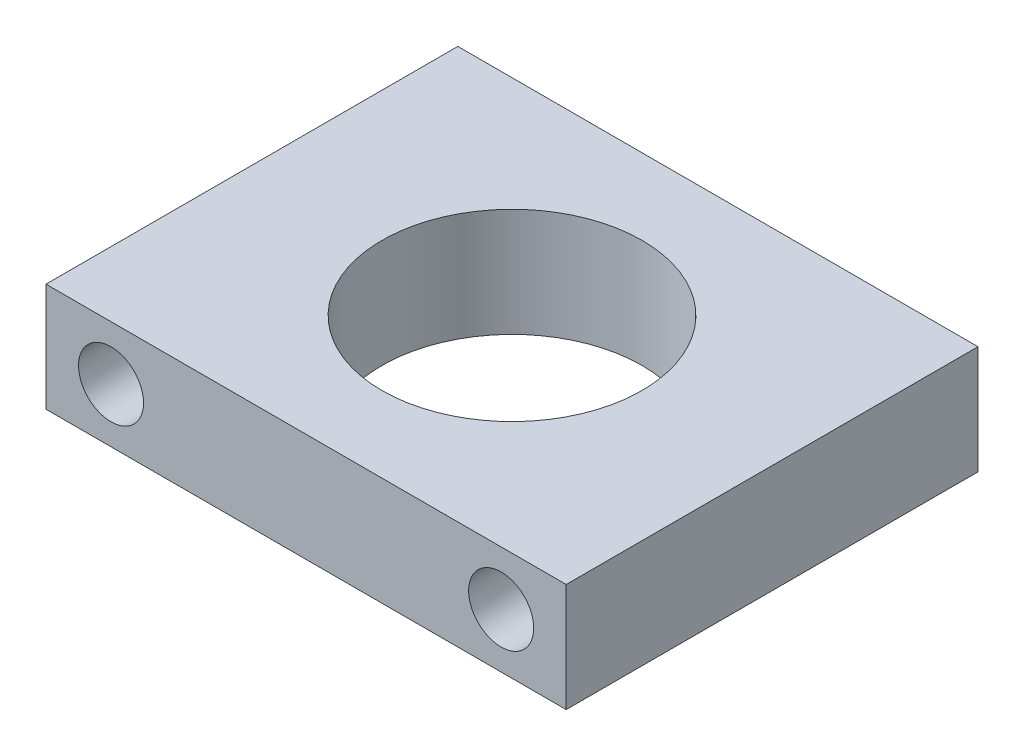
ISO-10303-21;
HEADER;
FILE_DESCRIPTION(('STEP AP214'),'2;1');
FILE_NAME('part.step','',(''),(''),'','','');
FILE_SCHEMA(('AUTOMOTIVE_DESIGN { 1 0 10303 214 1 1 1 1 }'));
ENDSEC;
DATA;
#1=APPLICATION_CONTEXT('core data for automotive mechanical design processes');
#2=APPLICATION_PROTOCOL_DEFINITION('international standard','automotive_design',2000,#1);
#3=PRODUCT_CONTEXT('',#1,'mechanical');
#4=PRODUCT('Part','Part','',(#3));
#5=PRODUCT_RELATED_PRODUCT_CATEGORY('part','',(#4));
#6=PRODUCT_DEFINITION_FORMATION('','',#4);
#7=PRODUCT_DEFINITION_CONTEXT('part definition',#1,'design');
#8=PRODUCT_DEFINITION('design','',#6,#7);
#9=PRODUCT_DEFINITION_SHAPE('','',#8);
#10=(LENGTH_UNIT() NAMED_UNIT(*) SI_UNIT(.MILLI.,.METRE.));
#11=(NAMED_UNIT(*) PLANE_ANGLE_UNIT() SI_UNIT($,.RADIAN.));
#12=(NAMED_UNIT(*) SI_UNIT($,.STERADIAN.) SOLID_ANGLE_UNIT());
#13=UNCERTAINTY_MEASURE_WITH_UNIT(LENGTH_MEASURE(1.E-05),#10,'distance_accuracy_value','');
#14=(GEOMETRIC_REPRESENTATION_CONTEXT(3) GLOBAL_UNCERTAINTY_ASSIGNED_CONTEXT((#13)) GLOBAL_UNIT_ASSIGNED_CONTEXT((#10,
#11,#12)) REPRESENTATION_CONTEXT('',''));
#15=CARTESIAN_POINT('',(0.,0.,0.));
#16=DIRECTION('',(0.,0.,1.));
#17=DIRECTION('',(1.,0.,0.));
#18=AXIS2_PLACEMENT_3D('',#15,#16,#17);
#19=CARTESIAN_POINT('',(12.,5.,-9.5));
#20=DIRECTION('',(-1.,0.,0.));
#21=DIRECTION('',(0.,0.,1.));
#22=AXIS2_PLACEMENT_3D('',#19,#20,#21);
#23=PLANE('',#22);
#24=DIRECTION('',(0.,0.,-1.));
#25=VECTOR('',#24,1.);
#26=CARTESIAN_POINT('',(12.,0.,-9.5));
#27=LINE('',#26,#25);
#28=CARTESIAN_POINT('',(12.,0.,9.5));
#29=VERTEX_POINT('',#28);
#30=CARTESIAN_POINT('',(12.,0.,-9.5));
#31=VERTEX_POINT('',#30);
#32=EDGE_CURVE('E98',#29,#31,#27,.T.);
#33=ORIENTED_EDGE('',*,*,#32,.T.);
#34=DIRECTION('',(0.,-1.,0.));
#35=VECTOR('',#34,1.);
#36=CARTESIAN_POINT('',(12.,5.,-9.5));
#37=LINE('',#36,#35);
#38=CARTESIAN_POINT('',(12.,5.,-9.5));
#39=VERTEX_POINT('',#38);
#40=EDGE_CURVE('E11',#39,#31,#37,.T.);
#41=ORIENTED_EDGE('',*,*,#40,.F.);
#42=DIRECTION('',(0.,0.,-1.));
#43=VECTOR('',#42,1.);
#44=CARTESIAN_POINT('',(12.,5.,-9.5));
#45=LINE('',#44,#43);
#46=CARTESIAN_POINT('',(12.,5.,9.5));
#47=VERTEX_POINT('',#46);
#48=EDGE_CURVE('E86',#47,#39,#45,.T.);
#49=ORIENTED_EDGE('',*,*,#48,.F.);
#50=DIRECTION('',(0.,-1.,0.));
#51=VECTOR('',#50,1.);
#52=CARTESIAN_POINT('',(12.,5.,9.5));
#53=LINE('',#52,#51);
#54=EDGE_CURVE('E94',#47,#29,#53,.T.);
#55=ORIENTED_EDGE('',*,*,#54,.T.);
#56=EDGE_LOOP('',(#33,#41,#49,#55));
#57=FACE_BOUND('',#56,.T.);
#58=ADVANCED_FACE('F35',(#57),#23,.F.);
#59=CARTESIAN_POINT('',(-12.,5.,-9.5));
#60=DIRECTION('',(0.,0.,1.));
#61=DIRECTION('',(1.,0.,0.));
#62=AXIS2_PLACEMENT_3D('',#59,#60,#61);
#63=PLANE('',#62);
#64=CARTESIAN_POINT('',(-9.,2.5,-9.5));
#65=DIRECTION('',(0.,0.,1.));
#66=DIRECTION('',(1.,0.,0.));
#67=AXIS2_PLACEMENT_3D('',#64,#65,#66);
#68=CIRCLE('',#67,1.5);
#69=CARTESIAN_POINT('',(-7.5,2.5,-9.5));
#70=VERTEX_POINT('',#69);
#71=EDGE_CURVE('E117',#70,#70,#68,.F.);
#72=ORIENTED_EDGE('',*,*,#71,.F.);
#73=EDGE_LOOP('',(#72));
#74=FACE_BOUND('',#73,.T.);
#75=CARTESIAN_POINT('',(9.,2.5,-9.5));
#76=DIRECTION('',(0.,0.,1.));
#77=DIRECTION('',(1.,0.,0.));
#78=AXIS2_PLACEMENT_3D('',#75,#76,#77);
#79=CIRCLE('',#78,1.5);
#80=CARTESIAN_POINT('',(10.5,2.5,-9.5));
#81=VERTEX_POINT('',#80);
#82=EDGE_CURVE('E118',#81,#81,#79,.F.);
#83=ORIENTED_EDGE('',*,*,#82,.F.);
#84=EDGE_LOOP('',(#83));
#85=FACE_BOUND('',#84,.T.);
#86=DIRECTION('',(-1.,0.,0.));
#87=VECTOR('',#86,1.);
#88=CARTESIAN_POINT('',(-12.,0.,-9.5));
#89=LINE('',#88,#87);
#90=CARTESIAN_POINT('',(-12.,0.,-9.5));
#91=VERTEX_POINT('',#90);
#92=EDGE_CURVE('E90',#31,#91,#89,.T.);
#93=ORIENTED_EDGE('',*,*,#92,.T.);
#94=DIRECTION('',(0.,-1.,0.));
#95=VECTOR('',#94,1.);
#96=CARTESIAN_POINT('',(-12.,5.,-9.5));
#97=LINE('',#96,#95);
#98=CARTESIAN_POINT('',(-12.,5.,-9.5));
#99=VERTEX_POINT('',#98);
#100=EDGE_CURVE('E43',#99,#91,#97,.T.);
#101=ORIENTED_EDGE('',*,*,#100,.F.);
#102=DIRECTION('',(-1.,0.,0.));
#103=VECTOR('',#102,1.);
#104=CARTESIAN_POINT('',(-12.,5.,-9.5));
#105=LINE('',#104,#103);
#106=EDGE_CURVE('E81',#39,#99,#105,.T.);
#107=ORIENTED_EDGE('',*,*,#106,.F.);
#108=ORIENTED_EDGE('',*,*,#40,.T.);
#109=EDGE_LOOP('',(#93,#101,#107,#108));
#110=FACE_BOUND('',#109,.T.);
#111=ADVANCED_FACE('F89',(#74,#85,#110),#63,.F.);
#112=CARTESIAN_POINT('',(-12.,5.,-9.5));
#113=DIRECTION('',(1.,0.,0.));
#114=DIRECTION('',(0.,0.,-1.));
#115=AXIS2_PLACEMENT_3D('',#112,#113,#114);
#116=PLANE('',#115);
#117=DIRECTION('',(0.,0.,1.));
#118=VECTOR('',#117,1.);
#119=CARTESIAN_POINT('',(-12.,0.,-9.5));
#120=LINE('',#119,#118);
#121=CARTESIAN_POINT('',(-12.,0.,9.5));
#122=VERTEX_POINT('',#121);
#123=EDGE_CURVE('E68',#91,#122,#120,.T.);
#124=ORIENTED_EDGE('',*,*,#123,.T.);
#125=DIRECTION('',(0.,-1.,0.));
#126=VECTOR('',#125,1.);
#127=CARTESIAN_POINT('',(-12.,5.,9.5));
#128=LINE('',#127,#126);
#129=CARTESIAN_POINT('',(-12.,5.,9.5));
#130=VERTEX_POINT('',#129);
#131=EDGE_CURVE('E91',#130,#122,#128,.T.);
#132=ORIENTED_EDGE('',*,*,#131,.F.);
#133=DIRECTION('',(0.,0.,1.));
#134=VECTOR('',#133,1.);
#135=CARTESIAN_POINT('',(-12.,5.,-9.5));
#136=LINE('',#135,#134);
#137=EDGE_CURVE('E84',#99,#130,#136,.T.);
#138=ORIENTED_EDGE('',*,*,#137,.F.);
#139=ORIENTED_EDGE('',*,*,#100,.T.);
#140=EDGE_LOOP('',(#124,#132,#138,#139));
#141=FACE_BOUND('',#140,.T.);
#142=ADVANCED_FACE('F92',(#141),#116,.F.);
#143=CARTESIAN_POINT('',(-12.,5.,9.5));
#144=DIRECTION('',(0.,0.,-1.));
#145=DIRECTION('',(-1.,0.,0.));
#146=AXIS2_PLACEMENT_3D('',#143,#144,#145);
#147=PLANE('',#146);
#148=CARTESIAN_POINT('',(-9.,2.5,9.5));
#149=DIRECTION('',(0.,0.,1.));
#150=DIRECTION('',(1.,0.,0.));
#151=AXIS2_PLACEMENT_3D('',#148,#149,#150);
#152=CIRCLE('',#151,1.5);
#153=CARTESIAN_POINT('',(-7.5,2.5,9.5));
#154=VERTEX_POINT('',#153);
#155=EDGE_CURVE('E121',#154,#154,#152,.T.);
#156=ORIENTED_EDGE('',*,*,#155,.F.);
#157=EDGE_LOOP('',(#156));
#158=FACE_BOUND('',#157,.T.);
#159=CARTESIAN_POINT('',(9.,2.5,9.5));
#160=DIRECTION('',(0.,0.,1.));
#161=DIRECTION('',(1.,0.,0.));
#162=AXIS2_PLACEMENT_3D('',#159,#160,#161);
#163=CIRCLE('',#162,1.5);
#164=CARTESIAN_POINT('',(10.5,2.5,9.5));
#165=VERTEX_POINT('',#164);
#166=EDGE_CURVE('E122',#165,#165,#163,.T.);
#167=ORIENTED_EDGE('',*,*,#166,.F.);
#168=EDGE_LOOP('',(#167));
#169=FACE_BOUND('',#168,.T.);
#170=DIRECTION('',(1.,0.,0.));
#171=VECTOR('',#170,1.);
#172=CARTESIAN_POINT('',(-12.,0.,9.5));
#173=LINE('',#172,#171);
#174=EDGE_CURVE('E74',#122,#29,#173,.T.);
#175=ORIENTED_EDGE('',*,*,#174,.T.);
#176=ORIENTED_EDGE('',*,*,#54,.F.);
#177=DIRECTION('',(1.,0.,0.));
#178=VECTOR('',#177,1.);
#179=CARTESIAN_POINT('',(-12.,5.,9.5));
#180=LINE('',#179,#178);
#181=EDGE_CURVE('E51',#130,#47,#180,.T.);
#182=ORIENTED_EDGE('',*,*,#181,.F.);
#183=ORIENTED_EDGE('',*,*,#131,.T.);
#184=EDGE_LOOP('',(#175,#176,#182,#183));
#185=FACE_BOUND('',#184,.T.);
#186=ADVANCED_FACE('F106',(#158,#169,#185),#147,.F.);
#187=CARTESIAN_POINT('',(0.,5.,0.));
#188=DIRECTION('',(0.,1.,0.));
#189=DIRECTION('',(0.,0.,1.));
#190=AXIS2_PLACEMENT_3D('',#187,#188,#189);
#191=PLANE('',#190);
#192=CARTESIAN_POINT('',(0.,5.,0.));
#193=DIRECTION('',(0.,1.,0.));
#194=DIRECTION('',(0.,0.,1.));
#195=AXIS2_PLACEMENT_3D('',#192,#193,#194);
#196=CIRCLE('',#195,6.);
#197=CARTESIAN_POINT('',(0.,5.,6.));
#198=VERTEX_POINT('',#197);
#199=EDGE_CURVE('E114',#198,#198,#196,.T.);
#200=ORIENTED_EDGE('',*,*,#199,.F.);
#201=EDGE_LOOP('',(#200));
#202=FACE_BOUND('',#201,.T.);
#203=ORIENTED_EDGE('',*,*,#48,.T.);
#204=ORIENTED_EDGE('',*,*,#106,.T.);
#205=ORIENTED_EDGE('',*,*,#137,.T.);
#206=ORIENTED_EDGE('',*,*,#181,.T.);
#207=EDGE_LOOP('',(#203,#204,#205,#206));
#208=FACE_BOUND('',#207,.T.);
#209=ADVANCED_FACE('F82',(#202,#208),#191,.T.);
#210=CARTESIAN_POINT('',(0.,0.,0.));
#211=DIRECTION('',(0.,1.,0.));
#212=DIRECTION('',(0.,0.,1.));
#213=AXIS2_PLACEMENT_3D('',#210,#211,#212);
#214=PLANE('',#213);
#215=CARTESIAN_POINT('',(0.,0.,0.));
#216=DIRECTION('',(0.,1.,0.));
#217=DIRECTION('',(0.,0.,1.));
#218=AXIS2_PLACEMENT_3D('',#215,#216,#217);
#219=CIRCLE('',#218,6.);
#220=CARTESIAN_POINT('',(0.,0.,6.));
#221=VERTEX_POINT('',#220);
#222=EDGE_CURVE('E101',#221,#221,#219,.F.);
#223=ORIENTED_EDGE('',*,*,#222,.F.);
#224=EDGE_LOOP('',(#223));
#225=FACE_BOUND('',#224,.T.);
#226=ORIENTED_EDGE('',*,*,#32,.F.);
#227=ORIENTED_EDGE('',*,*,#174,.F.);
#228=ORIENTED_EDGE('',*,*,#123,.F.);
#229=ORIENTED_EDGE('',*,*,#92,.F.);
#230=EDGE_LOOP('',(#226,#227,#228,#229));
#231=FACE_BOUND('',#230,.T.);
#232=ADVANCED_FACE('F109',(#225,#231),#214,.F.);
#233=CARTESIAN_POINT('',(0.,-0.00100000000000013,0.));
#234=DIRECTION('',(0.,1.,0.));
#235=DIRECTION('',(0.,0.,1.));
#236=AXIS2_PLACEMENT_3D('',#233,#234,#235);
#237=CYLINDRICAL_SURFACE('',#236,6.);
#238=ORIENTED_EDGE('',*,*,#199,.T.);
#239=EDGE_LOOP('',(#238));
#240=FACE_BOUND('',#239,.T.);
#241=ORIENTED_EDGE('',*,*,#222,.T.);
#242=EDGE_LOOP('',(#241));
#243=FACE_BOUND('',#242,.T.);
#244=ADVANCED_FACE('F141',(#240,#243),#237,.F.);
#245=CARTESIAN_POINT('',(9.,2.5,-9.501));
#246=DIRECTION('',(0.,0.,1.));
#247=DIRECTION('',(1.,0.,0.));
#248=AXIS2_PLACEMENT_3D('',#245,#246,#247);
#249=CYLINDRICAL_SURFACE('',#248,1.5);
#250=ORIENTED_EDGE('',*,*,#166,.T.);
#251=EDGE_LOOP('',(#250));
#252=FACE_BOUND('',#251,.T.);
#253=ORIENTED_EDGE('',*,*,#82,.T.);
#254=EDGE_LOOP('',(#253));
#255=FACE_BOUND('',#254,.T.);
#256=ADVANCED_FACE('F138',(#252,#255),#249,.F.);
#257=CARTESIAN_POINT('',(-9.,2.5,-9.501));
#258=DIRECTION('',(0.,0.,1.));
#259=DIRECTION('',(1.,0.,0.));
#260=AXIS2_PLACEMENT_3D('',#257,#258,#259);
#261=CYLINDRICAL_SURFACE('',#260,1.5);
#262=ORIENTED_EDGE('',*,*,#155,.T.);
#263=EDGE_LOOP('',(#262));
#264=FACE_BOUND('',#263,.T.);
#265=ORIENTED_EDGE('',*,*,#71,.T.);
#266=EDGE_LOOP('',(#265));
#267=FACE_BOUND('',#266,.T.);
#268=ADVANCED_FACE('F130',(#264,#267),#261,.F.);
#269=CLOSED_SHELL('',(#58,#111,#142,#186,#209,#232,#244,#256,#268));
#270=MANIFOLD_SOLID_BREP('B2',#269);
#271=ADVANCED_BREP_SHAPE_REPRESENTATION('',(#18,#270),#14);
#272=SHAPE_DEFINITION_REPRESENTATION(#9,#271);
ENDSEC;
END-ISO-10303-21;
